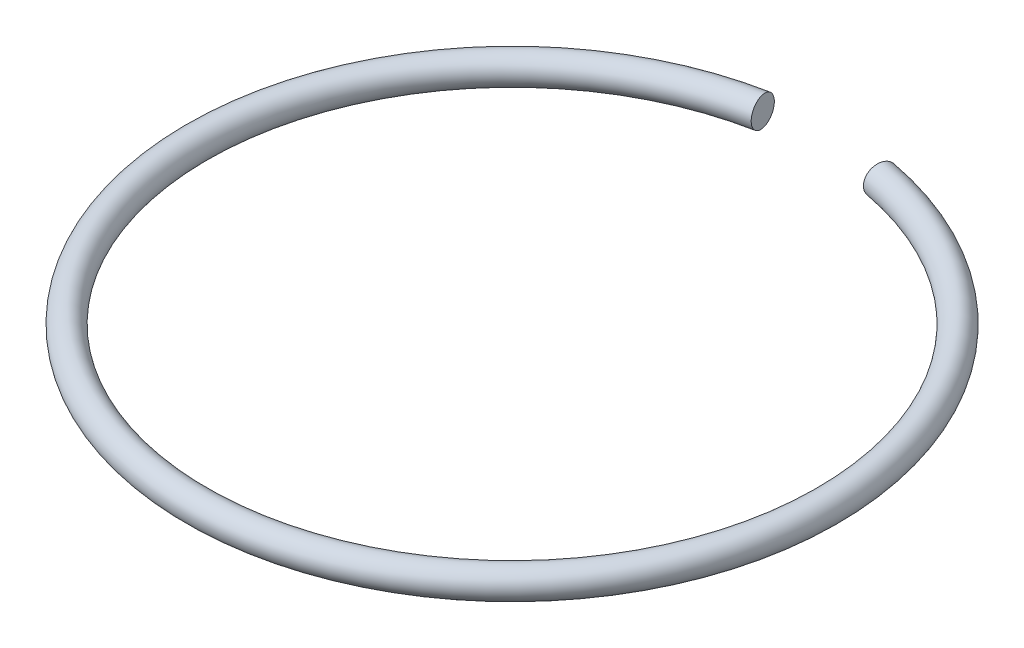
ISO-10303-21;
HEADER;
FILE_DESCRIPTION(('STEP AP214'),'2;1');
FILE_NAME('part.step','',(''),(''),'','','');
FILE_SCHEMA(('AUTOMOTIVE_DESIGN { 1 0 10303 214 1 1 1 1 }'));
ENDSEC;
DATA;
#1=APPLICATION_CONTEXT('core data for automotive mechanical design processes');
#2=APPLICATION_PROTOCOL_DEFINITION('international standard','automotive_design',2000,#1);
#3=PRODUCT_CONTEXT('',#1,'mechanical');
#4=PRODUCT('Part','Part','',(#3));
#5=PRODUCT_RELATED_PRODUCT_CATEGORY('part','',(#4));
#6=PRODUCT_DEFINITION_FORMATION('','',#4);
#7=PRODUCT_DEFINITION_CONTEXT('part definition',#1,'design');
#8=PRODUCT_DEFINITION('design','',#6,#7);
#9=PRODUCT_DEFINITION_SHAPE('','',#8);
#10=(LENGTH_UNIT() NAMED_UNIT(*) SI_UNIT(.MILLI.,.METRE.));
#11=(NAMED_UNIT(*) PLANE_ANGLE_UNIT() SI_UNIT($,.RADIAN.));
#12=(NAMED_UNIT(*) SI_UNIT($,.STERADIAN.) SOLID_ANGLE_UNIT());
#13=UNCERTAINTY_MEASURE_WITH_UNIT(LENGTH_MEASURE(1.E-05),#10,'distance_accuracy_value','');
#14=(GEOMETRIC_REPRESENTATION_CONTEXT(3) GLOBAL_UNCERTAINTY_ASSIGNED_CONTEXT((#13)) GLOBAL_UNIT_ASSIGNED_CONTEXT((#10,
#11,#12)) REPRESENTATION_CONTEXT('',''));
#15=CARTESIAN_POINT('',(0.,0.,0.));
#16=DIRECTION('',(0.,0.,1.));
#17=DIRECTION('',(1.,0.,0.));
#18=AXIS2_PLACEMENT_3D('',#15,#16,#17);
#19=CARTESIAN_POINT('',(0.,5.61866002214838,0.));
#20=DIRECTION('',(0.,-1.,0.));
#21=DIRECTION('',(0.,0.,-1.));
#22=AXIS2_PLACEMENT_3D('',#19,#20,#21);
#23=TOROIDAL_SURFACE('',#22,32.5,1.5);
#24=CARTESIAN_POINT('',(6.066720377262,5.61866002214838,-31.928747295566));
#25=DIRECTION('',(-0.982422993709724,0.,-0.186668319300369));
#26=DIRECTION('',(-0.186668319300369,0.,0.982422993709724));
#27=AXIS2_PLACEMENT_3D('',#24,#25,#26);
#28=CIRCLE('',#27,1.5);
#29=CARTESIAN_POINT('',(6.34672285621255,5.61866002214838,-33.4023817861306));
#30=VERTEX_POINT('',#29);
#31=EDGE_CURVE('E37',#30,#30,#28,.F.);
#32=CARTESIAN_POINT('',(-6.066720377262,5.61866002214838,-31.928747295566));
#33=DIRECTION('',(0.982422993709724,0.,-0.186668319300369));
#34=DIRECTION('',(-0.186668319300369,0.,-0.982422993709724));
#35=AXIS2_PLACEMENT_3D('',#32,#33,#34);
#36=CIRCLE('',#35,1.5);
#37=CARTESIAN_POINT('',(-6.34672285621255,5.61866002214838,-33.4023817861306));
#38=VERTEX_POINT('',#37);
#39=EDGE_CURVE('E10',#38,#38,#36,.F.);
#40=CARTESIAN_POINT('',(0.,5.61866002214838,0.));
#41=DIRECTION('',(0.,-1.,0.));
#42=DIRECTION('',(0.,0.,-1.));
#43=AXIS2_PLACEMENT_3D('',#40,#41,#42);
#44=CIRCLE('',#43,34.);
#45=EDGE_CURVE('',#30,#38,#44,.T.);
#46=ORIENTED_EDGE('',*,*,#31,.T.);
#47=ORIENTED_EDGE('',*,*,#39,.T.);
#48=ORIENTED_EDGE('',*,*,#45,.T.);
#49=ORIENTED_EDGE('',*,*,#45,.F.);
#50=EDGE_LOOP('',(#46,#48,#47,#49));
#51=FACE_BOUND('',#50,.T.);
#52=ADVANCED_FACE('F31',(#51),#23,.T.);
#53=CARTESIAN_POINT('',(0.,10.,0.));
#54=DIRECTION('',(-0.982422993709724,0.,-0.186668319300369));
#55=DIRECTION('',(-0.186668319300369,0.,0.982422993709724));
#56=AXIS2_PLACEMENT_3D('',#53,#54,#55);
#57=PLANE('',#56);
#58=ORIENTED_EDGE('',*,*,#31,.F.);
#59=EDGE_LOOP('',(#58));
#60=FACE_BOUND('',#59,.T.);
#61=ADVANCED_FACE('F44',(#60),#57,.T.);
#62=CARTESIAN_POINT('',(0.,10.,0.));
#63=DIRECTION('',(0.982422993709724,0.,-0.186668319300369));
#64=DIRECTION('',(-0.186668319300369,0.,-0.982422993709724));
#65=AXIS2_PLACEMENT_3D('',#62,#63,#64);
#66=PLANE('',#65);
#67=ORIENTED_EDGE('',*,*,#39,.F.);
#68=EDGE_LOOP('',(#67));
#69=FACE_BOUND('',#68,.T.);
#70=ADVANCED_FACE('F46',(#69),#66,.T.);
#71=CLOSED_SHELL('',(#52,#61,#70));
#72=MANIFOLD_SOLID_BREP('B2',#71);
#73=ADVANCED_BREP_SHAPE_REPRESENTATION('',(#18,#72),#14);
#74=SHAPE_DEFINITION_REPRESENTATION(#9,#73);
ENDSEC;
END-ISO-10303-21;
